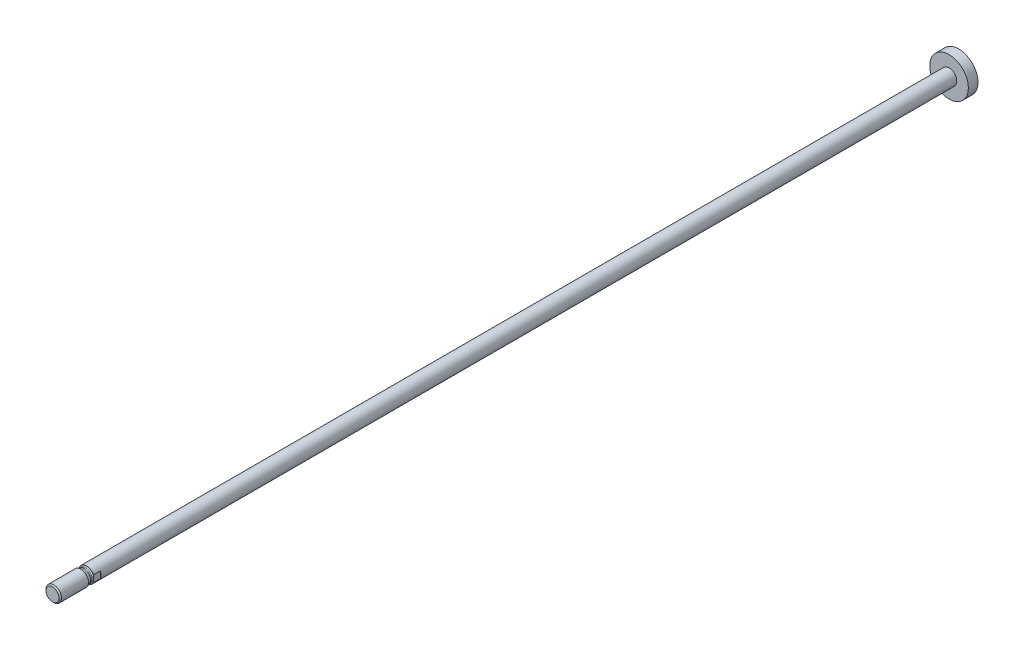
ISO-10303-21;
HEADER;
FILE_DESCRIPTION(('STEP AP214'),'2;1');
FILE_NAME('part.step','',(''),(''),'','','');
FILE_SCHEMA(('AUTOMOTIVE_DESIGN { 1 0 10303 214 1 1 1 1 }'));
ENDSEC;
DATA;
#1=APPLICATION_CONTEXT('core data for automotive mechanical design processes');
#2=APPLICATION_PROTOCOL_DEFINITION('international standard','automotive_design',2000,#1);
#3=PRODUCT_CONTEXT('',#1,'mechanical');
#4=PRODUCT('Part','Part','',(#3));
#5=PRODUCT_RELATED_PRODUCT_CATEGORY('part','',(#4));
#6=PRODUCT_DEFINITION_FORMATION('','',#4);
#7=PRODUCT_DEFINITION_CONTEXT('part definition',#1,'design');
#8=PRODUCT_DEFINITION('design','',#6,#7);
#9=PRODUCT_DEFINITION_SHAPE('','',#8);
#10=(LENGTH_UNIT() NAMED_UNIT(*) SI_UNIT(.MILLI.,.METRE.));
#11=(NAMED_UNIT(*) PLANE_ANGLE_UNIT() SI_UNIT($,.RADIAN.));
#12=(NAMED_UNIT(*) SI_UNIT($,.STERADIAN.) SOLID_ANGLE_UNIT());
#13=UNCERTAINTY_MEASURE_WITH_UNIT(LENGTH_MEASURE(1.E-05),#10,'distance_accuracy_value','');
#14=(GEOMETRIC_REPRESENTATION_CONTEXT(3) GLOBAL_UNCERTAINTY_ASSIGNED_CONTEXT((#13)) GLOBAL_UNIT_ASSIGNED_CONTEXT((#10,
#11,#12)) REPRESENTATION_CONTEXT('',''));
#15=CARTESIAN_POINT('',(0.,0.,0.));
#16=DIRECTION('',(0.,0.,1.));
#17=DIRECTION('',(1.,0.,0.));
#18=AXIS2_PLACEMENT_3D('',#15,#16,#17);
#19=CARTESIAN_POINT('',(0.,0.,28.));
#20=DIRECTION('',(0.,0.,-1.));
#21=DIRECTION('',(-1.,0.,0.));
#22=AXIS2_PLACEMENT_3D('',#19,#20,#21);
#23=PLANE('',#22);
#24=CARTESIAN_POINT('',(0.,0.,28.00000000002));
#25=DIRECTION('',(0.,0.,-1.));
#26=DIRECTION('',(-1.,0.,0.));
#27=AXIS2_PLACEMENT_3D('',#24,#25,#26);
#28=CIRCLE('',#27,4.23299999994242);
#29=CARTESIAN_POINT('',(-4.23299999994242,0.,28.00000000002));
#30=VERTEX_POINT('',#29);
#31=EDGE_CURVE('E20',#30,#30,#28,.T.);
#32=ORIENTED_EDGE('',*,*,#31,.F.);
#33=EDGE_LOOP('',(#32));
#34=FACE_BOUND('',#33,.T.);
#35=ADVANCED_FACE('F17',(#34),#23,.F.);
#36=CARTESIAN_POINT('',(0.,0.,27.2330000000807));
#37=DIRECTION('',(0.,0.,-1.));
#38=DIRECTION('',(-1.,0.,0.));
#39=AXIS2_PLACEMENT_3D('',#36,#37,#38);
#40=CONICAL_SURFACE('',#39,4.99999999988177,0.785398163397448);
#41=ORIENTED_EDGE('',*,*,#31,.T.);
#42=EDGE_LOOP('',(#41));
#43=FACE_BOUND('',#42,.T.);
#44=CARTESIAN_POINT('',(0.,0.,27.233));
#45=DIRECTION('',(0.,0.,1.));
#46=DIRECTION('',(1.,0.,0.));
#47=AXIS2_PLACEMENT_3D('',#44,#45,#46);
#48=CIRCLE('',#47,5.);
#49=CARTESIAN_POINT('',(5.,0.,27.233));
#50=VERTEX_POINT('',#49);
#51=EDGE_CURVE('E254',#50,#50,#48,.F.);
#52=ORIENTED_EDGE('',*,*,#51,.F.);
#53=EDGE_LOOP('',(#52));
#54=FACE_BOUND('',#53,.T.);
#55=ADVANCED_FACE('F241',(#43,#54),#40,.T.);
#56=CARTESIAN_POINT('',(0.,0.,5.));
#57=DIRECTION('',(0.,0.,1.));
#58=DIRECTION('',(1.,0.,0.));
#59=AXIS2_PLACEMENT_3D('',#56,#57,#58);
#60=CYLINDRICAL_SURFACE('',#59,5.);
#61=ORIENTED_EDGE('',*,*,#51,.T.);
#62=EDGE_LOOP('',(#61));
#63=FACE_BOUND('',#62,.T.);
#64=CARTESIAN_POINT('',(0.,0.,9.69798193557381));
#65=DIRECTION('',(0.,0.,1.));
#66=DIRECTION('',(1.,0.,0.));
#67=AXIS2_PLACEMENT_3D('',#64,#65,#66);
#68=CIRCLE('',#67,4.99999999999545);
#69=CARTESIAN_POINT('',(4.99999999999545,0.,9.69798193557381));
#70=VERTEX_POINT('',#69);
#71=EDGE_CURVE('E255',#70,#70,#68,.F.);
#72=ORIENTED_EDGE('',*,*,#71,.F.);
#73=EDGE_LOOP('',(#72));
#74=FACE_BOUND('',#73,.T.);
#75=ADVANCED_FACE('F238',(#63,#74),#60,.T.);
#76=CARTESIAN_POINT('',(0.,0.,9.69798193557381));
#77=DIRECTION('',(0.,0.,1.));
#78=DIRECTION('',(1.,0.,0.));
#79=AXIS2_PLACEMENT_3D('',#76,#77,#78);
#80=CONICAL_SURFACE('',#79,4.99999999999545,0.349065850396762);
#81=ORIENTED_EDGE('',*,*,#71,.T.);
#82=EDGE_LOOP('',(#81));
#83=FACE_BOUND('',#82,.T.);
#84=CARTESIAN_POINT('',(0.,0.,7.59941589757032));
#85=DIRECTION('',(0.,0.,-1.));
#86=DIRECTION('',(-1.,0.,0.));
#87=AXIS2_PLACEMENT_3D('',#84,#85,#86);
#88=CIRCLE('',#87,4.23618442752846);
#89=CARTESIAN_POINT('',(-4.23618442752846,0.,7.59941589757032));
#90=VERTEX_POINT('',#89);
#91=EDGE_CURVE('E221',#90,#90,#88,.F.);
#92=ORIENTED_EDGE('',*,*,#91,.T.);
#93=EDGE_LOOP('',(#92));
#94=FACE_BOUND('',#93,.T.);
#95=ADVANCED_FACE('F233',(#83,#94),#80,.T.);
#96=CARTESIAN_POINT('',(0.,0.,7.39420381157492));
#97=DIRECTION('',(0.,0.,-1.));
#98=DIRECTION('',(-1.,0.,0.));
#99=AXIS2_PLACEMENT_3D('',#96,#97,#98);
#100=TOROIDAL_SURFACE('',#99,4.8,0.599999999999999);
#101=ORIENTED_EDGE('',*,*,#91,.F.);
#102=EDGE_LOOP('',(#101));
#103=FACE_BOUND('',#102,.T.);
#104=CARTESIAN_POINT('',(0.,0.,7.39420381157492));
#105=DIRECTION('',(0.,0.,1.));
#106=DIRECTION('',(1.,0.,0.));
#107=AXIS2_PLACEMENT_3D('',#104,#105,#106);
#108=CIRCLE('',#107,4.2);
#109=CARTESIAN_POINT('',(4.2,0.,7.39420381157492));
#110=VERTEX_POINT('',#109);
#111=EDGE_CURVE('E212',#110,#110,#108,.F.);
#112=ORIENTED_EDGE('',*,*,#111,.F.);
#113=EDGE_LOOP('',(#112));
#114=FACE_BOUND('',#113,.T.);
#115=ADVANCED_FACE('F228',(#103,#114),#100,.F.);
#116=CARTESIAN_POINT('',(0.,12.5,-558.85));
#117=DIRECTION('',(0.,0.,1.));
#118=DIRECTION('',(1.,0.,0.));
#119=AXIS2_PLACEMENT_3D('',#116,#117,#118);
#120=PLANE('',#119);
#121=CARTESIAN_POINT('',(0.,0.,-558.85));
#122=DIRECTION('',(0.,0.,1.));
#123=DIRECTION('',(1.,0.,0.));
#124=AXIS2_PLACEMENT_3D('',#121,#122,#123);
#125=CIRCLE('',#124,12.5);
#126=CARTESIAN_POINT('',(12.5,0.,-558.85));
#127=VERTEX_POINT('',#126);
#128=EDGE_CURVE('E220',#127,#127,#125,.T.);
#129=ORIENTED_EDGE('',*,*,#128,.F.);
#130=EDGE_LOOP('',(#129));
#131=FACE_BOUND('',#130,.T.);
#132=ADVANCED_FACE('F232',(#131),#120,.F.);
#133=CARTESIAN_POINT('',(0.,0.,5.));
#134=DIRECTION('',(0.,0.,1.));
#135=DIRECTION('',(1.,0.,0.));
#136=AXIS2_PLACEMENT_3D('',#133,#134,#135);
#137=CYLINDRICAL_SURFACE('',#136,4.2);
#138=ORIENTED_EDGE('',*,*,#111,.T.);
#139=EDGE_LOOP('',(#138));
#140=FACE_BOUND('',#139,.T.);
#141=CARTESIAN_POINT('',(0.,0.,6.6));
#142=DIRECTION('',(0.,0.,-1.));
#143=DIRECTION('',(-1.,0.,0.));
#144=AXIS2_PLACEMENT_3D('',#141,#142,#143);
#145=CIRCLE('',#144,4.2);
#146=CARTESIAN_POINT('',(-4.2,0.,6.6));
#147=VERTEX_POINT('',#146);
#148=EDGE_CURVE('E276',#147,#147,#145,.F.);
#149=ORIENTED_EDGE('',*,*,#148,.T.);
#150=EDGE_LOOP('',(#149));
#151=FACE_BOUND('',#150,.T.);
#152=ADVANCED_FACE('F271',(#140,#151),#137,.T.);
#153=CARTESIAN_POINT('',(0.,0.,-558.85));
#154=DIRECTION('',(0.,0.,1.));
#155=DIRECTION('',(1.,0.,0.));
#156=AXIS2_PLACEMENT_3D('',#153,#154,#155);
#157=CYLINDRICAL_SURFACE('',#156,12.5);
#158=CARTESIAN_POINT('',(0.,0.,-552.6));
#159=DIRECTION('',(0.,0.,1.));
#160=DIRECTION('',(1.,0.,0.));
#161=AXIS2_PLACEMENT_3D('',#158,#159,#160);
#162=CIRCLE('',#161,12.5);
#163=CARTESIAN_POINT('',(12.5,0.,-552.6));
#164=VERTEX_POINT('',#163);
#165=EDGE_CURVE('E204',#164,#164,#162,.F.);
#166=ORIENTED_EDGE('',*,*,#165,.T.);
#167=EDGE_LOOP('',(#166));
#168=FACE_BOUND('',#167,.T.);
#169=ORIENTED_EDGE('',*,*,#128,.T.);
#170=EDGE_LOOP('',(#169));
#171=FACE_BOUND('',#170,.T.);
#172=ADVANCED_FACE('F174',(#168,#171),#157,.T.);
#173=CARTESIAN_POINT('',(0.,0.,6.6));
#174=DIRECTION('',(0.,0.,-1.));
#175=DIRECTION('',(-1.,0.,0.));
#176=AXIS2_PLACEMENT_3D('',#173,#174,#175);
#177=TOROIDAL_SURFACE('',#176,4.8,0.599999999999998);
#178=ORIENTED_EDGE('',*,*,#148,.F.);
#179=EDGE_LOOP('',(#178));
#180=FACE_BOUND('',#179,.T.);
#181=CARTESIAN_POINT('',(-4.5,-1.670329308849,6.));
#182=CARTESIAN_POINT('',(-4.5,-1.6369330513631,6.00000117040223));
#183=CARTESIAN_POINT('',(-4.5,-1.60353870008505,6.00033761281317));
#184=CARTESIAN_POINT('',(-4.5,-1.53678402517574,6.00158286188886));
#185=CARTESIAN_POINT('',(-4.5,-1.50342369418502,6.00249126346591));
#186=CARTESIAN_POINT('',(-4.5,-1.43672915385537,6.00478221519337));
#187=CARTESIAN_POINT('',(-4.5,-1.403394939861,6.00616463519658));
#188=CARTESIAN_POINT('',(-4.5,-1.33675010316127,6.0093127773252));
#189=CARTESIAN_POINT('',(-4.5,-1.30343947758629,6.0110784396036));
#190=CARTESIAN_POINT('',(-4.5,-1.23682740984282,6.01490639659544));
#191=CARTESIAN_POINT('',(-4.5,-1.20352597189788,6.01696876357747));
#192=CARTESIAN_POINT('',(-4.5,-1.13692453490198,6.02130706454382));
#193=CARTESIAN_POINT('',(-4.5,-1.10362454110037,6.02358307854023));
#194=CARTESIAN_POINT('',(-4.5,-0.970055500660211,6.03297450091988));
#195=CARTESIAN_POINT('',(-4.5,-0.869824880093467,6.04061462109113));
#196=CARTESIAN_POINT('',(-4.5,-0.669294095444825,6.05497755898394));
#197=CARTESIAN_POINT('',(-4.5,-0.568993932116027,6.06170038648787));
#198=CARTESIAN_POINT('',(-4.5,-0.368332410875038,6.07244573968657));
#199=CARTESIAN_POINT('',(-4.5,-0.26797120652601,6.076470876583));
#200=CARTESIAN_POINT('',(-4.5,-0.0672525736976672,6.08072036023677));
#201=CARTESIAN_POINT('',(-4.5,0.0331047738284561,6.08094818941855));
#202=CARTESIAN_POINT('',(-4.5,0.233769564385185,6.07754740137777));
#203=CARTESIAN_POINT('',(-4.5,0.334076991677368,6.07391793974281));
#204=CARTESIAN_POINT('',(-4.5,0.534637397699597,6.06379928349027));
#205=CARTESIAN_POINT('',(-4.5,0.634890214053077,6.05730714852695));
#206=CARTESIAN_POINT('',(-4.5,0.835373518086889,6.04317942656312));
#207=CARTESIAN_POINT('',(-4.5,0.935603947060965,6.03554308551951));
#208=CARTESIAN_POINT('',(-4.5,1.13611388640718,6.02119700715942));
#209=CARTESIAN_POINT('',(-4.5,1.23639337665127,6.01448702408238));
#210=CARTESIAN_POINT('',(-4.5,1.39231556393481,6.00654495544654));
#211=CARTESIAN_POINT('',(-4.5,1.44789697514886,6.00420470218304));
#212=CARTESIAN_POINT('',(-4.5,1.55909116687587,6.00093588356944));
#213=CARTESIAN_POINT('',(-4.5,1.61470394147135,6.00000710765029));
#214=CARTESIAN_POINT('',(-4.5,1.67032930884898,6.));
#215=B_SPLINE_CURVE_WITH_KNOTS('',3,(#181,#182,#183,#184,#185,#186,#187,#188,#189,#190,#191,
#192,#193,#194,#195,#196,#197,#198,#199,#200,#201,#202,#203,#204,#205,#206,#207,#208,#209,#210,
#211,#212,#213,#214),.UNSPECIFIED.,.F.,.F.,(4,2,2,2,2,2,2,2,2,2,2,2,2,2,2,2,4),(0.,
0.100184360814044,0.200297846163573,0.300383866187946,0.400454268039522,0.500549085512339,
0.600681539794873,0.902246113316891,1.20380747058151,1.50507651146084,1.80606925014599,
2.10712789373254,2.4084964874746,2.71006456677907,3.01155248641771,3.17842827063363,
3.34527915730057),.UNSPECIFIED.);
#216=CARTESIAN_POINT('',(-4.5,-1.670329308849,6.));
#217=VERTEX_POINT('',#216);
#218=CARTESIAN_POINT('',(-4.5,1.67032930884898,5.99999999999986));
#219=VERTEX_POINT('',#218);
#220=EDGE_CURVE('E100',#217,#219,#215,.T.);
#221=ORIENTED_EDGE('',*,*,#220,.F.);
#222=CARTESIAN_POINT('',(0.,0.,6.));
#223=DIRECTION('',(0.,0.,1.));
#224=DIRECTION('',(-0.9375,-0.347985272676876,0.));
#225=AXIS2_PLACEMENT_3D('',#222,#223,#224);
#226=CIRCLE('',#225,4.79999999999999);
#227=CARTESIAN_POINT('',(4.5,-1.67032930884898,5.99999999999993));
#228=VERTEX_POINT('',#227);
#229=EDGE_CURVE('E144',#217,#228,#226,.T.);
#230=ORIENTED_EDGE('',*,*,#229,.T.);
#231=CARTESIAN_POINT('',(4.5,1.670329308849,6.));
#232=CARTESIAN_POINT('',(4.5,1.6369330513631,6.00000117040223));
#233=CARTESIAN_POINT('',(4.5,1.60353870008505,6.00033761281317));
#234=CARTESIAN_POINT('',(4.5,1.53678402517574,6.00158286188886));
#235=CARTESIAN_POINT('',(4.5,1.50342369418502,6.00249126346591));
#236=CARTESIAN_POINT('',(4.5,1.43672915385538,6.00478221519337));
#237=CARTESIAN_POINT('',(4.5,1.403394939861,6.00616463519658));
#238=CARTESIAN_POINT('',(4.5,1.33675010316128,6.0093127773252));
#239=CARTESIAN_POINT('',(4.5,1.30343947758629,6.0110784396036));
#240=CARTESIAN_POINT('',(4.5,1.23682740984282,6.01490639659544));
#241=CARTESIAN_POINT('',(4.5,1.20352597189788,6.01696876357747));
#242=CARTESIAN_POINT('',(4.5,1.13692453490198,6.02130706454382));
#243=CARTESIAN_POINT('',(4.5,1.10362454110037,6.02358307854023));
#244=CARTESIAN_POINT('',(4.5,0.970055500660213,6.03297450091988));
#245=CARTESIAN_POINT('',(4.5,0.869824880093468,6.04061462109113));
#246=CARTESIAN_POINT('',(4.5,0.669294095444826,6.05497755898394));
#247=CARTESIAN_POINT('',(4.5,0.568993932116028,6.06170038648787));
#248=CARTESIAN_POINT('',(4.5,0.368332410875039,6.07244573968657));
#249=CARTESIAN_POINT('',(4.5,0.267971206526011,6.076470876583));
#250=CARTESIAN_POINT('',(4.5,0.0672525736976679,6.08072036023677));
#251=CARTESIAN_POINT('',(4.5,-0.0331047738284553,6.08094818941855));
#252=CARTESIAN_POINT('',(4.5,-0.233769564385184,6.07754740137777));
#253=CARTESIAN_POINT('',(4.5,-0.334076991677367,6.07391793974281));
#254=CARTESIAN_POINT('',(4.5,-0.534637397699596,6.06379928349027));
#255=CARTESIAN_POINT('',(4.5,-0.634890214053076,6.05730714852695));
#256=CARTESIAN_POINT('',(4.5,-0.835373518086889,6.04317942656312));
#257=CARTESIAN_POINT('',(4.5,-0.935603947060965,6.03554308551951));
#258=CARTESIAN_POINT('',(4.5,-1.13611388640718,6.02119700715942));
#259=CARTESIAN_POINT('',(4.5,-1.23639337665127,6.01448702408238));
#260=CARTESIAN_POINT('',(4.5,-1.39231556393481,6.00654495544654));
#261=CARTESIAN_POINT('',(4.5,-1.44789697514886,6.00420470218304));
#262=CARTESIAN_POINT('',(4.5,-1.55909116687587,6.00093588356944));
#263=CARTESIAN_POINT('',(4.5,-1.61470394147135,6.00000710765029));
#264=CARTESIAN_POINT('',(4.5,-1.67032930884898,6.));
#265=B_SPLINE_CURVE_WITH_KNOTS('',3,(#231,#232,#233,#234,#235,#236,#237,#238,#239,#240,#241,
#242,#243,#244,#245,#246,#247,#248,#249,#250,#251,#252,#253,#254,#255,#256,#257,#258,#259,#260,
#261,#262,#263,#264),.UNSPECIFIED.,.F.,.F.,(4,2,2,2,2,2,2,2,2,2,2,2,2,2,2,2,4),(0.,
0.100184360814044,0.200297846163573,0.300383866187946,0.400454268039522,0.500549085512339,
0.600681539794873,0.902246113316891,1.20380747058151,1.50507651146084,1.80606925014599,
2.10712789373254,2.4084964874746,2.71006456677907,3.01155248641771,3.17842827063363,
3.34527915730057),.UNSPECIFIED.);
#266=CARTESIAN_POINT('',(4.5,1.670329308849,6.));
#267=VERTEX_POINT('',#266);
#268=EDGE_CURVE('E76',#267,#228,#265,.T.);
#269=ORIENTED_EDGE('',*,*,#268,.F.);
#270=CARTESIAN_POINT('',(0.,0.,6.));
#271=DIRECTION('',(0.,0.,1.));
#272=DIRECTION('',(0.9375,0.347985272676875,0.));
#273=AXIS2_PLACEMENT_3D('',#270,#271,#272);
#274=CIRCLE('',#273,4.79999999999999);
#275=EDGE_CURVE('E71',#267,#219,#274,.T.);
#276=ORIENTED_EDGE('',*,*,#275,.T.);
#277=EDGE_LOOP('',(#221,#230,#269,#276));
#278=FACE_BOUND('',#277,.T.);
#279=ADVANCED_FACE('F111',(#180,#278),#177,.F.);
#280=CARTESIAN_POINT('',(0.,5.,-552.6));
#281=DIRECTION('',(0.,0.,-1.));
#282=DIRECTION('',(-1.,0.,0.));
#283=AXIS2_PLACEMENT_3D('',#280,#281,#282);
#284=PLANE('',#283);
#285=CARTESIAN_POINT('',(0.,0.,-552.6));
#286=DIRECTION('',(0.,0.,1.));
#287=DIRECTION('',(1.,0.,0.));
#288=AXIS2_PLACEMENT_3D('',#285,#286,#287);
#289=CIRCLE('',#288,5.);
#290=CARTESIAN_POINT('',(5.,0.,-552.6));
#291=VERTEX_POINT('',#290);
#292=EDGE_CURVE('E93',#291,#291,#289,.T.);
#293=ORIENTED_EDGE('',*,*,#292,.F.);
#294=EDGE_LOOP('',(#293));
#295=FACE_BOUND('',#294,.T.);
#296=ORIENTED_EDGE('',*,*,#165,.F.);
#297=EDGE_LOOP('',(#296));
#298=FACE_BOUND('',#297,.T.);
#299=ADVANCED_FACE('F167',(#295,#298),#284,.F.);
#300=CARTESIAN_POINT('',(0.,0.,6.));
#301=DIRECTION('',(0.,0.,-1.));
#302=DIRECTION('',(-1.,0.,0.));
#303=AXIS2_PLACEMENT_3D('',#300,#301,#302);
#304=PLANE('',#303);
#305=CARTESIAN_POINT('',(0.,0.,6.00000000000001));
#306=DIRECTION('',(0.,0.,1.));
#307=DIRECTION('',(1.,0.,0.));
#308=AXIS2_PLACEMENT_3D('',#305,#306,#307);
#309=CIRCLE('',#308,5.);
#310=CARTESIAN_POINT('',(-4.5,2.17944947177034,5.99999999999983));
#311=VERTEX_POINT('',#310);
#312=CARTESIAN_POINT('',(4.5,2.17944947177034,6.00000000000001));
#313=VERTEX_POINT('',#312);
#314=EDGE_CURVE('E68',#311,#313,#309,.F.);
#315=ORIENTED_EDGE('',*,*,#314,.F.);
#316=DIRECTION('',(0.,1.,0.));
#317=VECTOR('',#316,1.);
#318=CARTESIAN_POINT('',(-4.5,-9.,5.99999999999964));
#319=LINE('',#318,#317);
#320=EDGE_CURVE('E58',#219,#311,#319,.T.);
#321=ORIENTED_EDGE('',*,*,#320,.F.);
#322=ORIENTED_EDGE('',*,*,#275,.F.);
#323=DIRECTION('',(0.,1.,0.));
#324=VECTOR('',#323,1.);
#325=CARTESIAN_POINT('',(4.5,9.,6.00000000000001));
#326=LINE('',#325,#324);
#327=EDGE_CURVE('E64',#313,#267,#326,.F.);
#328=ORIENTED_EDGE('',*,*,#327,.F.);
#329=EDGE_LOOP('',(#315,#321,#322,#328));
#330=FACE_BOUND('',#329,.T.);
#331=ADVANCED_FACE('F66',(#330),#304,.F.);
#332=CARTESIAN_POINT('',(0.,0.,1.5));
#333=DIRECTION('',(0.,0.,1.));
#334=DIRECTION('',(1.,0.,0.));
#335=AXIS2_PLACEMENT_3D('',#332,#333,#334);
#336=PLANE('',#335);
#337=CARTESIAN_POINT('',(0.,0.,1.49999999999995));
#338=DIRECTION('',(0.,0.,1.));
#339=DIRECTION('',(1.,0.,0.));
#340=AXIS2_PLACEMENT_3D('',#337,#338,#339);
#341=CIRCLE('',#340,5.);
#342=CARTESIAN_POINT('',(4.5,2.17944947177034,1.49999999999995));
#343=VERTEX_POINT('',#342);
#344=CARTESIAN_POINT('',(4.5,-2.17944947177034,1.49999999999995));
#345=VERTEX_POINT('',#344);
#346=EDGE_CURVE('E86',#343,#345,#341,.F.);
#347=ORIENTED_EDGE('',*,*,#346,.F.);
#348=DIRECTION('',(0.,1.,0.));
#349=VECTOR('',#348,1.);
#350=CARTESIAN_POINT('',(4.5,9.,1.49999999999995));
#351=LINE('',#350,#349);
#352=EDGE_CURVE('E77',#345,#343,#351,.T.);
#353=ORIENTED_EDGE('',*,*,#352,.F.);
#354=EDGE_LOOP('',(#347,#353));
#355=FACE_BOUND('',#354,.T.);
#356=ADVANCED_FACE('F166',(#355),#336,.T.);
#357=CARTESIAN_POINT('',(4.5,9.,7.));
#358=DIRECTION('',(1.,0.,0.));
#359=DIRECTION('',(0.,0.,-1.));
#360=AXIS2_PLACEMENT_3D('',#357,#358,#359);
#361=PLANE('',#360);
#362=ORIENTED_EDGE('',*,*,#268,.T.);
#363=DIRECTION('',(0.,1.,0.));
#364=VECTOR('',#363,1.);
#365=CARTESIAN_POINT('',(4.5,0.,6.));
#366=LINE('',#365,#364);
#367=CARTESIAN_POINT('',(4.5,-2.17944947177034,6.));
#368=VERTEX_POINT('',#367);
#369=EDGE_CURVE('E137',#228,#368,#366,.F.);
#370=ORIENTED_EDGE('',*,*,#369,.T.);
#371=DIRECTION('',(0.,0.,1.));
#372=VECTOR('',#371,1.);
#373=CARTESIAN_POINT('',(4.5,-2.17944947177034,-558.85));
#374=LINE('',#373,#372);
#375=EDGE_CURVE('E147',#345,#368,#374,.T.);
#376=ORIENTED_EDGE('',*,*,#375,.F.);
#377=ORIENTED_EDGE('',*,*,#352,.T.);
#378=DIRECTION('',(0.,0.,1.));
#379=VECTOR('',#378,1.);
#380=CARTESIAN_POINT('',(4.5,2.17944947177034,-558.85));
#381=LINE('',#380,#379);
#382=EDGE_CURVE('E80',#313,#343,#381,.F.);
#383=ORIENTED_EDGE('',*,*,#382,.F.);
#384=ORIENTED_EDGE('',*,*,#327,.T.);
#385=EDGE_LOOP('',(#362,#370,#376,#377,#383,#384));
#386=FACE_BOUND('',#385,.T.);
#387=ADVANCED_FACE('F81',(#386),#361,.T.);
#388=CARTESIAN_POINT('',(0.,0.,6.));
#389=DIRECTION('',(0.,0.,-1.));
#390=DIRECTION('',(-1.,0.,0.));
#391=AXIS2_PLACEMENT_3D('',#388,#389,#390);
#392=PLANE('',#391);
#393=CARTESIAN_POINT('',(0.,0.,6.00000000000001));
#394=DIRECTION('',(0.,0.,1.));
#395=DIRECTION('',(1.,0.,0.));
#396=AXIS2_PLACEMENT_3D('',#393,#394,#395);
#397=CIRCLE('',#396,5.);
#398=CARTESIAN_POINT('',(-4.5,-2.17944947177034,6.00000000000001));
#399=VERTEX_POINT('',#398);
#400=EDGE_CURVE('E149',#368,#399,#397,.F.);
#401=ORIENTED_EDGE('',*,*,#400,.F.);
#402=ORIENTED_EDGE('',*,*,#369,.F.);
#403=ORIENTED_EDGE('',*,*,#229,.F.);
#404=DIRECTION('',(0.,1.,0.));
#405=VECTOR('',#404,1.);
#406=CARTESIAN_POINT('',(-4.5,-9.,6.00000000000001));
#407=LINE('',#406,#405);
#408=EDGE_CURVE('E102',#399,#217,#407,.T.);
#409=ORIENTED_EDGE('',*,*,#408,.F.);
#410=EDGE_LOOP('',(#401,#402,#403,#409));
#411=FACE_BOUND('',#410,.T.);
#412=ADVANCED_FACE('F122',(#411),#392,.F.);
#413=CARTESIAN_POINT('',(-4.5,-9.,7.));
#414=DIRECTION('',(-1.,0.,0.));
#415=DIRECTION('',(0.,0.,1.));
#416=AXIS2_PLACEMENT_3D('',#413,#414,#415);
#417=PLANE('',#416);
#418=ORIENTED_EDGE('',*,*,#220,.T.);
#419=ORIENTED_EDGE('',*,*,#320,.T.);
#420=DIRECTION('',(0.,0.,1.));
#421=VECTOR('',#420,1.);
#422=CARTESIAN_POINT('',(-4.5,2.17944947177034,-558.85));
#423=LINE('',#422,#421);
#424=CARTESIAN_POINT('',(-4.5,2.17944947177034,1.49999999999996));
#425=VERTEX_POINT('',#424);
#426=EDGE_CURVE('E91',#425,#311,#423,.T.);
#427=ORIENTED_EDGE('',*,*,#426,.F.);
#428=DIRECTION('',(0.,1.,0.));
#429=VECTOR('',#428,1.);
#430=CARTESIAN_POINT('',(-4.5,0.,1.5));
#431=LINE('',#430,#429);
#432=CARTESIAN_POINT('',(-4.5,-2.17944947177034,1.49999999999996));
#433=VERTEX_POINT('',#432);
#434=EDGE_CURVE('E35',#433,#425,#431,.T.);
#435=ORIENTED_EDGE('',*,*,#434,.F.);
#436=DIRECTION('',(0.,0.,1.));
#437=VECTOR('',#436,1.);
#438=CARTESIAN_POINT('',(-4.5,-2.17944947177034,-558.85));
#439=LINE('',#438,#437);
#440=EDGE_CURVE('E26',#399,#433,#439,.F.);
#441=ORIENTED_EDGE('',*,*,#440,.F.);
#442=ORIENTED_EDGE('',*,*,#408,.T.);
#443=EDGE_LOOP('',(#418,#419,#427,#435,#441,#442));
#444=FACE_BOUND('',#443,.T.);
#445=ADVANCED_FACE('F116',(#444),#417,.T.);
#446=CARTESIAN_POINT('',(0.,0.,1.5));
#447=DIRECTION('',(0.,0.,1.));
#448=DIRECTION('',(1.,0.,0.));
#449=AXIS2_PLACEMENT_3D('',#446,#447,#448);
#450=PLANE('',#449);
#451=CARTESIAN_POINT('',(0.,0.,1.49999999999995));
#452=DIRECTION('',(0.,0.,1.));
#453=DIRECTION('',(1.,0.,0.));
#454=AXIS2_PLACEMENT_3D('',#451,#452,#453);
#455=CIRCLE('',#454,5.);
#456=EDGE_CURVE('E11',#433,#425,#455,.F.);
#457=ORIENTED_EDGE('',*,*,#456,.F.);
#458=ORIENTED_EDGE('',*,*,#434,.T.);
#459=EDGE_LOOP('',(#457,#458));
#460=FACE_BOUND('',#459,.T.);
#461=ADVANCED_FACE('F121',(#460),#450,.T.);
#462=CARTESIAN_POINT('',(0.,0.,-558.85));
#463=DIRECTION('',(0.,0.,1.));
#464=DIRECTION('',(1.,0.,0.));
#465=AXIS2_PLACEMENT_3D('',#462,#463,#464);
#466=CYLINDRICAL_SURFACE('',#465,5.);
#467=ORIENTED_EDGE('',*,*,#440,.T.);
#468=ORIENTED_EDGE('',*,*,#456,.T.);
#469=ORIENTED_EDGE('',*,*,#426,.T.);
#470=ORIENTED_EDGE('',*,*,#314,.T.);
#471=ORIENTED_EDGE('',*,*,#382,.T.);
#472=ORIENTED_EDGE('',*,*,#346,.T.);
#473=ORIENTED_EDGE('',*,*,#375,.T.);
#474=ORIENTED_EDGE('',*,*,#400,.T.);
#475=EDGE_LOOP('',(#467,#468,#469,#470,#471,#472,#473,#474));
#476=FACE_BOUND('',#475,.T.);
#477=ORIENTED_EDGE('',*,*,#292,.T.);
#478=EDGE_LOOP('',(#477));
#479=FACE_BOUND('',#478,.T.);
#480=ADVANCED_FACE('F89',(#476,#479),#466,.T.);
#481=CLOSED_SHELL('',(#35,#55,#75,#95,#115,#132,#152,#172,#279,#299,#331,#356,#387,#412,#445,
#461,#480));
#482=MANIFOLD_SOLID_BREP('B1',#481);
#483=ADVANCED_BREP_SHAPE_REPRESENTATION('',(#18,#482),#14);
#484=SHAPE_DEFINITION_REPRESENTATION(#9,#483);
ENDSEC;
END-ISO-10303-21;
